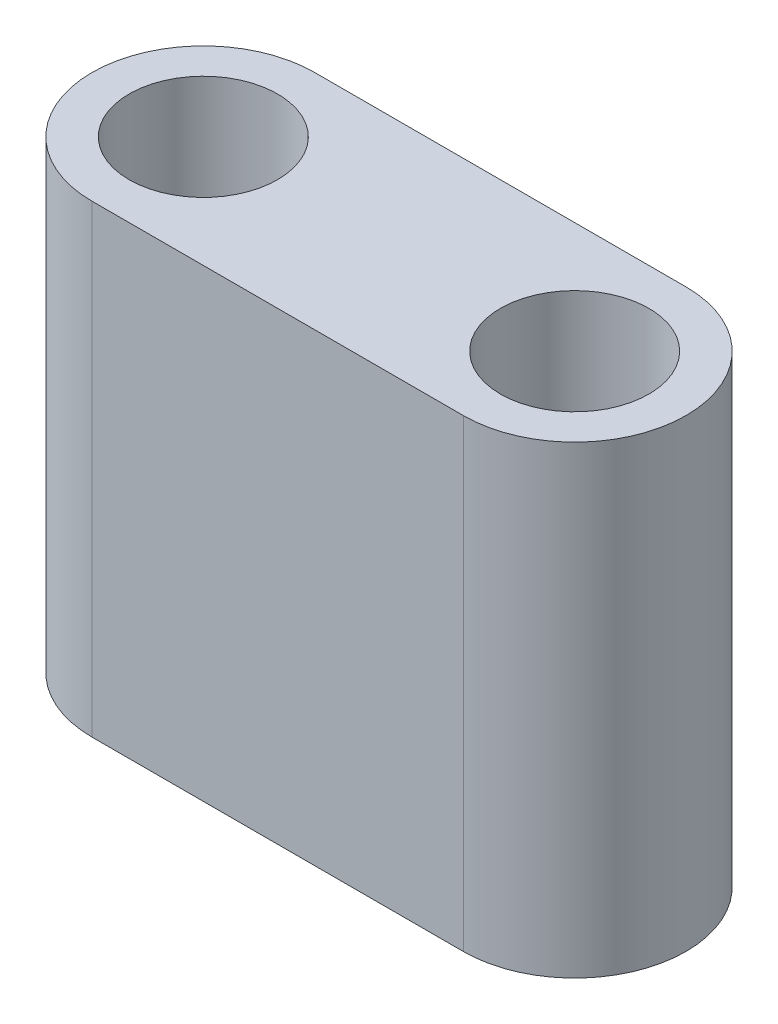
ISO-10303-21;
HEADER;
FILE_DESCRIPTION(('STEP AP214'),'2;1');
FILE_NAME('part.step','',(''),(''),'','','');
FILE_SCHEMA(('AUTOMOTIVE_DESIGN { 1 0 10303 214 1 1 1 1 }'));
ENDSEC;
DATA;
#1=APPLICATION_CONTEXT('core data for automotive mechanical design processes');
#2=APPLICATION_PROTOCOL_DEFINITION('international standard','automotive_design',2000,#1);
#3=PRODUCT_CONTEXT('',#1,'mechanical');
#4=PRODUCT('Part','Part','',(#3));
#5=PRODUCT_RELATED_PRODUCT_CATEGORY('part','',(#4));
#6=PRODUCT_DEFINITION_FORMATION('','',#4);
#7=PRODUCT_DEFINITION_CONTEXT('part definition',#1,'design');
#8=PRODUCT_DEFINITION('design','',#6,#7);
#9=PRODUCT_DEFINITION_SHAPE('','',#8);
#10=(LENGTH_UNIT() NAMED_UNIT(*) SI_UNIT(.MILLI.,.METRE.));
#11=(NAMED_UNIT(*) PLANE_ANGLE_UNIT() SI_UNIT($,.RADIAN.));
#12=(NAMED_UNIT(*) SI_UNIT($,.STERADIAN.) SOLID_ANGLE_UNIT());
#13=UNCERTAINTY_MEASURE_WITH_UNIT(LENGTH_MEASURE(1.E-05),#10,'distance_accuracy_value','');
#14=(GEOMETRIC_REPRESENTATION_CONTEXT(3) GLOBAL_UNCERTAINTY_ASSIGNED_CONTEXT((#13)) GLOBAL_UNIT_ASSIGNED_CONTEXT((#10,
#11,#12)) REPRESENTATION_CONTEXT('',''));
#15=CARTESIAN_POINT('',(0.,0.,0.));
#16=DIRECTION('',(0.,0.,1.));
#17=DIRECTION('',(1.,0.,0.));
#18=AXIS2_PLACEMENT_3D('',#15,#16,#17);
#19=CARTESIAN_POINT('',(-20.,-50.,0.));
#20=DIRECTION('',(0.,1.,0.));
#21=DIRECTION('',(0.,0.,1.));
#22=AXIS2_PLACEMENT_3D('',#19,#20,#21);
#23=CYLINDRICAL_SURFACE('',#22,12.);
#24=CARTESIAN_POINT('',(-20.,0.,0.));
#25=DIRECTION('',(0.,1.,0.));
#26=DIRECTION('',(0.,0.,1.));
#27=AXIS2_PLACEMENT_3D('',#24,#25,#26);
#28=CIRCLE('',#27,12.);
#29=CARTESIAN_POINT('',(-20.,0.,-12.));
#30=VERTEX_POINT('',#29);
#31=CARTESIAN_POINT('',(-20.,0.,12.));
#32=VERTEX_POINT('',#31);
#33=EDGE_CURVE('E110',#30,#32,#28,.T.);
#34=ORIENTED_EDGE('',*,*,#33,.F.);
#35=DIRECTION('',(0.,1.,0.));
#36=VECTOR('',#35,1.);
#37=CARTESIAN_POINT('',(-20.,-50.,-12.));
#38=LINE('',#37,#36);
#39=CARTESIAN_POINT('',(-20.,-50.,-12.));
#40=VERTEX_POINT('',#39);
#41=EDGE_CURVE('E11',#40,#30,#38,.T.);
#42=ORIENTED_EDGE('',*,*,#41,.F.);
#43=CARTESIAN_POINT('',(-20.,-50.,0.));
#44=DIRECTION('',(0.,1.,0.));
#45=DIRECTION('',(0.,0.,1.));
#46=AXIS2_PLACEMENT_3D('',#43,#44,#45);
#47=CIRCLE('',#46,12.);
#48=CARTESIAN_POINT('',(-20.,-50.,12.));
#49=VERTEX_POINT('',#48);
#50=EDGE_CURVE('E101',#40,#49,#47,.T.);
#51=ORIENTED_EDGE('',*,*,#50,.T.);
#52=DIRECTION('',(0.,1.,0.));
#53=VECTOR('',#52,1.);
#54=CARTESIAN_POINT('',(-20.,-50.,12.));
#55=LINE('',#54,#53);
#56=EDGE_CURVE('E42',#49,#32,#55,.T.);
#57=ORIENTED_EDGE('',*,*,#56,.T.);
#58=EDGE_LOOP('',(#34,#42,#51,#57));
#59=FACE_BOUND('',#58,.T.);
#60=ADVANCED_FACE('F39',(#59),#23,.T.);
#61=CARTESIAN_POINT('',(-20.,-50.,-12.));
#62=DIRECTION('',(0.,0.,-1.));
#63=DIRECTION('',(-1.,0.,0.));
#64=AXIS2_PLACEMENT_3D('',#61,#62,#63);
#65=PLANE('',#64);
#66=DIRECTION('',(-1.,0.,0.));
#67=VECTOR('',#66,1.);
#68=CARTESIAN_POINT('',(-20.,0.,-12.));
#69=LINE('',#68,#67);
#70=CARTESIAN_POINT('',(20.,0.,-12.));
#71=VERTEX_POINT('',#70);
#72=EDGE_CURVE('E104',#71,#30,#69,.T.);
#73=ORIENTED_EDGE('',*,*,#72,.F.);
#74=DIRECTION('',(0.,1.,0.));
#75=VECTOR('',#74,1.);
#76=CARTESIAN_POINT('',(20.,-50.,-12.));
#77=LINE('',#76,#75);
#78=CARTESIAN_POINT('',(20.,-50.,-12.));
#79=VERTEX_POINT('',#78);
#80=EDGE_CURVE('E49',#79,#71,#77,.T.);
#81=ORIENTED_EDGE('',*,*,#80,.F.);
#82=DIRECTION('',(-1.,0.,0.));
#83=VECTOR('',#82,1.);
#84=CARTESIAN_POINT('',(-20.,-50.,-12.));
#85=LINE('',#84,#83);
#86=EDGE_CURVE('E96',#79,#40,#85,.T.);
#87=ORIENTED_EDGE('',*,*,#86,.T.);
#88=ORIENTED_EDGE('',*,*,#41,.T.);
#89=EDGE_LOOP('',(#73,#81,#87,#88));
#90=FACE_BOUND('',#89,.T.);
#91=ADVANCED_FACE('F127',(#90),#65,.T.);
#92=CARTESIAN_POINT('',(20.,-50.,0.));
#93=DIRECTION('',(0.,1.,0.));
#94=DIRECTION('',(0.,0.,1.));
#95=AXIS2_PLACEMENT_3D('',#92,#93,#94);
#96=CYLINDRICAL_SURFACE('',#95,12.);
#97=CARTESIAN_POINT('',(20.,0.,0.));
#98=DIRECTION('',(0.,1.,0.));
#99=DIRECTION('',(0.,0.,-1.));
#100=AXIS2_PLACEMENT_3D('',#97,#98,#99);
#101=CIRCLE('',#100,12.);
#102=CARTESIAN_POINT('',(20.,0.,12.));
#103=VERTEX_POINT('',#102);
#104=EDGE_CURVE('E90',#103,#71,#101,.T.);
#105=ORIENTED_EDGE('',*,*,#104,.F.);
#106=DIRECTION('',(0.,1.,0.));
#107=VECTOR('',#106,1.);
#108=CARTESIAN_POINT('',(20.,-50.,12.));
#109=LINE('',#108,#107);
#110=CARTESIAN_POINT('',(20.,-50.,12.));
#111=VERTEX_POINT('',#110);
#112=EDGE_CURVE('E85',#111,#103,#109,.T.);
#113=ORIENTED_EDGE('',*,*,#112,.F.);
#114=CARTESIAN_POINT('',(20.,-50.,0.));
#115=DIRECTION('',(0.,1.,0.));
#116=DIRECTION('',(0.,0.,-1.));
#117=AXIS2_PLACEMENT_3D('',#114,#115,#116);
#118=CIRCLE('',#117,12.);
#119=EDGE_CURVE('E88',#111,#79,#118,.T.);
#120=ORIENTED_EDGE('',*,*,#119,.T.);
#121=ORIENTED_EDGE('',*,*,#80,.T.);
#122=EDGE_LOOP('',(#105,#113,#120,#121));
#123=FACE_BOUND('',#122,.T.);
#124=ADVANCED_FACE('F87',(#123),#96,.T.);
#125=CARTESIAN_POINT('',(-20.,-50.,12.));
#126=DIRECTION('',(0.,0.,1.));
#127=DIRECTION('',(1.,0.,0.));
#128=AXIS2_PLACEMENT_3D('',#125,#126,#127);
#129=PLANE('',#128);
#130=DIRECTION('',(1.,0.,0.));
#131=VECTOR('',#130,1.);
#132=CARTESIAN_POINT('',(-20.,0.,12.));
#133=LINE('',#132,#131);
#134=EDGE_CURVE('E114',#32,#103,#133,.T.);
#135=ORIENTED_EDGE('',*,*,#134,.F.);
#136=ORIENTED_EDGE('',*,*,#56,.F.);
#137=DIRECTION('',(1.,0.,0.));
#138=VECTOR('',#137,1.);
#139=CARTESIAN_POINT('',(-20.,-50.,12.));
#140=LINE('',#139,#138);
#141=EDGE_CURVE('E95',#49,#111,#140,.T.);
#142=ORIENTED_EDGE('',*,*,#141,.T.);
#143=ORIENTED_EDGE('',*,*,#112,.T.);
#144=EDGE_LOOP('',(#135,#136,#142,#143));
#145=FACE_BOUND('',#144,.T.);
#146=ADVANCED_FACE('F99',(#145),#129,.T.);
#147=CARTESIAN_POINT('',(-20.,-50.,0.));
#148=DIRECTION('',(0.,1.,0.));
#149=DIRECTION('',(0.,0.,1.));
#150=AXIS2_PLACEMENT_3D('',#147,#148,#149);
#151=PLANE('',#150);
#152=CARTESIAN_POINT('',(20.,-50.,0.));
#153=DIRECTION('',(0.,1.,0.));
#154=DIRECTION('',(0.,0.,1.));
#155=AXIS2_PLACEMENT_3D('',#152,#153,#154);
#156=CIRCLE('',#155,8.);
#157=CARTESIAN_POINT('',(20.,-50.,7.99999999999999));
#158=VERTEX_POINT('',#157);
#159=EDGE_CURVE('E160',#158,#158,#156,.T.);
#160=ORIENTED_EDGE('',*,*,#159,.T.);
#161=EDGE_LOOP('',(#160));
#162=FACE_BOUND('',#161,.T.);
#163=CARTESIAN_POINT('',(-20.,-50.,0.));
#164=DIRECTION('',(0.,1.,0.));
#165=DIRECTION('',(0.,0.,1.));
#166=AXIS2_PLACEMENT_3D('',#163,#164,#165);
#167=CIRCLE('',#166,8.);
#168=CARTESIAN_POINT('',(-20.,-50.,8.));
#169=VERTEX_POINT('',#168);
#170=EDGE_CURVE('E115',#169,#169,#167,.T.);
#171=ORIENTED_EDGE('',*,*,#170,.T.);
#172=EDGE_LOOP('',(#171));
#173=FACE_BOUND('',#172,.T.);
#174=ORIENTED_EDGE('',*,*,#50,.F.);
#175=ORIENTED_EDGE('',*,*,#86,.F.);
#176=ORIENTED_EDGE('',*,*,#119,.F.);
#177=ORIENTED_EDGE('',*,*,#141,.F.);
#178=EDGE_LOOP('',(#174,#175,#176,#177));
#179=FACE_BOUND('',#178,.T.);
#180=ADVANCED_FACE('F94',(#162,#173,#179),#151,.F.);
#181=CARTESIAN_POINT('',(-20.,0.,0.));
#182=DIRECTION('',(0.,1.,0.));
#183=DIRECTION('',(0.,0.,1.));
#184=AXIS2_PLACEMENT_3D('',#181,#182,#183);
#185=PLANE('',#184);
#186=CARTESIAN_POINT('',(20.,0.,0.));
#187=DIRECTION('',(0.,1.,0.));
#188=DIRECTION('',(0.,0.,1.));
#189=AXIS2_PLACEMENT_3D('',#186,#187,#188);
#190=CIRCLE('',#189,8.);
#191=CARTESIAN_POINT('',(20.,0.,7.99999999999999));
#192=VERTEX_POINT('',#191);
#193=EDGE_CURVE('E163',#192,#192,#190,.T.);
#194=ORIENTED_EDGE('',*,*,#193,.F.);
#195=EDGE_LOOP('',(#194));
#196=FACE_BOUND('',#195,.T.);
#197=CARTESIAN_POINT('',(-20.,0.,0.));
#198=DIRECTION('',(0.,1.,0.));
#199=DIRECTION('',(0.,0.,1.));
#200=AXIS2_PLACEMENT_3D('',#197,#198,#199);
#201=CIRCLE('',#200,8.);
#202=CARTESIAN_POINT('',(-20.,0.,8.));
#203=VERTEX_POINT('',#202);
#204=EDGE_CURVE('E167',#203,#203,#201,.T.);
#205=ORIENTED_EDGE('',*,*,#204,.F.);
#206=EDGE_LOOP('',(#205));
#207=FACE_BOUND('',#206,.T.);
#208=ORIENTED_EDGE('',*,*,#33,.T.);
#209=ORIENTED_EDGE('',*,*,#134,.T.);
#210=ORIENTED_EDGE('',*,*,#104,.T.);
#211=ORIENTED_EDGE('',*,*,#72,.T.);
#212=EDGE_LOOP('',(#208,#209,#210,#211));
#213=FACE_BOUND('',#212,.T.);
#214=ADVANCED_FACE('F126',(#196,#207,#213),#185,.T.);
#215=CARTESIAN_POINT('',(-20.,-50.,0.));
#216=DIRECTION('',(0.,1.,0.));
#217=DIRECTION('',(0.,0.,1.));
#218=AXIS2_PLACEMENT_3D('',#215,#216,#217);
#219=CYLINDRICAL_SURFACE('',#218,8.);
#220=ORIENTED_EDGE('',*,*,#170,.F.);
#221=EDGE_LOOP('',(#220));
#222=FACE_BOUND('',#221,.T.);
#223=ORIENTED_EDGE('',*,*,#204,.T.);
#224=EDGE_LOOP('',(#223));
#225=FACE_BOUND('',#224,.T.);
#226=ADVANCED_FACE('F145',(#222,#225),#219,.F.);
#227=CARTESIAN_POINT('',(20.,-50.,0.));
#228=DIRECTION('',(0.,1.,0.));
#229=DIRECTION('',(0.,0.,1.));
#230=AXIS2_PLACEMENT_3D('',#227,#228,#229);
#231=CYLINDRICAL_SURFACE('',#230,8.);
#232=ORIENTED_EDGE('',*,*,#159,.F.);
#233=EDGE_LOOP('',(#232));
#234=FACE_BOUND('',#233,.T.);
#235=ORIENTED_EDGE('',*,*,#193,.T.);
#236=EDGE_LOOP('',(#235));
#237=FACE_BOUND('',#236,.T.);
#238=ADVANCED_FACE('F152',(#234,#237),#231,.F.);
#239=CLOSED_SHELL('',(#60,#91,#124,#146,#180,#214,#226,#238));
#240=MANIFOLD_SOLID_BREP('B2',#239);
#241=ADVANCED_BREP_SHAPE_REPRESENTATION('',(#18,#240),#14);
#242=SHAPE_DEFINITION_REPRESENTATION(#9,#241);
ENDSEC;
END-ISO-10303-21;
